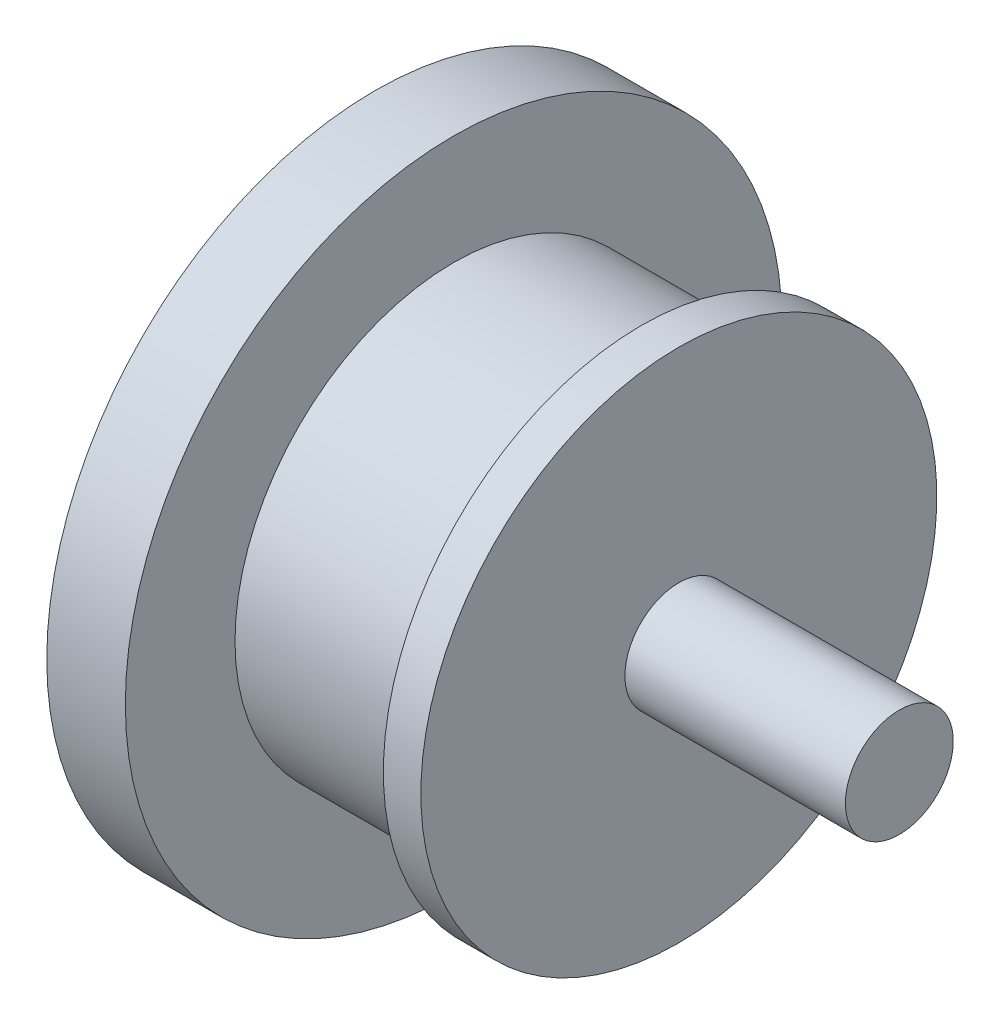
ISO-10303-21;
HEADER;
FILE_DESCRIPTION(('STEP AP214'),'2;1');
FILE_NAME('part.step','',(''),(''),'','','');
FILE_SCHEMA(('AUTOMOTIVE_DESIGN { 1 0 10303 214 1 1 1 1 }'));
ENDSEC;
DATA;
#1=APPLICATION_CONTEXT('core data for automotive mechanical design processes');
#2=APPLICATION_PROTOCOL_DEFINITION('international standard','automotive_design',2000,#1);
#3=PRODUCT_CONTEXT('',#1,'mechanical');
#4=PRODUCT('Part','Part','',(#3));
#5=PRODUCT_RELATED_PRODUCT_CATEGORY('part','',(#4));
#6=PRODUCT_DEFINITION_FORMATION('','',#4);
#7=PRODUCT_DEFINITION_CONTEXT('part definition',#1,'design');
#8=PRODUCT_DEFINITION('design','',#6,#7);
#9=PRODUCT_DEFINITION_SHAPE('','',#8);
#10=(LENGTH_UNIT() NAMED_UNIT(*) SI_UNIT(.MILLI.,.METRE.));
#11=(NAMED_UNIT(*) PLANE_ANGLE_UNIT() SI_UNIT($,.RADIAN.));
#12=(NAMED_UNIT(*) SI_UNIT($,.STERADIAN.) SOLID_ANGLE_UNIT());
#13=UNCERTAINTY_MEASURE_WITH_UNIT(LENGTH_MEASURE(1.E-05),#10,'distance_accuracy_value','');
#14=(GEOMETRIC_REPRESENTATION_CONTEXT(3) GLOBAL_UNCERTAINTY_ASSIGNED_CONTEXT((#13)) GLOBAL_UNIT_ASSIGNED_CONTEXT((#10,
#11,#12)) REPRESENTATION_CONTEXT('',''));
#15=CARTESIAN_POINT('',(0.,0.,0.));
#16=DIRECTION('',(0.,0.,1.));
#17=DIRECTION('',(1.,0.,0.));
#18=AXIS2_PLACEMENT_3D('',#15,#16,#17);
#19=CARTESIAN_POINT('',(15.,0.,0.));
#20=DIRECTION('',(1.,0.,0.));
#21=DIRECTION('',(0.,1.,0.));
#22=AXIS2_PLACEMENT_3D('',#19,#20,#21);
#23=PLANE('',#22);
#24=CARTESIAN_POINT('',(15.,0.,0.));
#25=DIRECTION('',(1.,0.,0.));
#26=DIRECTION('',(0.,1.,0.));
#27=AXIS2_PLACEMENT_3D('',#24,#25,#26);
#28=CIRCLE('',#27,2.3);
#29=CARTESIAN_POINT('',(15.,2.3,0.));
#30=VERTEX_POINT('',#29);
#31=EDGE_CURVE('E10',#30,#30,#28,.T.);
#32=ORIENTED_EDGE('',*,*,#31,.T.);
#33=EDGE_LOOP('',(#32));
#34=FACE_BOUND('',#33,.T.);
#35=ADVANCED_FACE('F31',(#34),#23,.T.);
#36=CARTESIAN_POINT('',(0.,0.,0.));
#37=DIRECTION('',(1.,0.,0.));
#38=DIRECTION('',(0.,1.,0.));
#39=AXIS2_PLACEMENT_3D('',#36,#37,#38);
#40=CYLINDRICAL_SURFACE('',#39,2.3);
#41=CARTESIAN_POINT('',(5.6,0.,0.));
#42=DIRECTION('',(1.,0.,0.));
#43=DIRECTION('',(0.,1.,0.));
#44=AXIS2_PLACEMENT_3D('',#41,#42,#43);
#45=CIRCLE('',#44,2.3);
#46=CARTESIAN_POINT('',(5.6,2.3,0.));
#47=VERTEX_POINT('',#46);
#48=EDGE_CURVE('E37',#47,#47,#45,.T.);
#49=ORIENTED_EDGE('',*,*,#48,.T.);
#50=EDGE_LOOP('',(#49));
#51=FACE_BOUND('',#50,.T.);
#52=ORIENTED_EDGE('',*,*,#31,.F.);
#53=EDGE_LOOP('',(#52));
#54=FACE_BOUND('',#53,.T.);
#55=ADVANCED_FACE('F75',(#51,#54),#40,.T.);
#56=CARTESIAN_POINT('',(5.6,11.,0.));
#57=DIRECTION('',(1.,0.,0.));
#58=DIRECTION('',(0.,1.,0.));
#59=AXIS2_PLACEMENT_3D('',#56,#57,#58);
#60=PLANE('',#59);
#61=CARTESIAN_POINT('',(5.6,0.,0.));
#62=DIRECTION('',(1.,0.,0.));
#63=DIRECTION('',(0.,1.,0.));
#64=AXIS2_PLACEMENT_3D('',#61,#62,#63);
#65=CIRCLE('',#64,11.);
#66=CARTESIAN_POINT('',(5.6,11.,0.));
#67=VERTEX_POINT('',#66);
#68=EDGE_CURVE('E41',#67,#67,#65,.T.);
#69=ORIENTED_EDGE('',*,*,#68,.T.);
#70=EDGE_LOOP('',(#69));
#71=FACE_BOUND('',#70,.T.);
#72=ORIENTED_EDGE('',*,*,#48,.F.);
#73=EDGE_LOOP('',(#72));
#74=FACE_BOUND('',#73,.T.);
#75=ADVANCED_FACE('F79',(#71,#74),#60,.T.);
#76=CARTESIAN_POINT('',(0.,0.,0.));
#77=DIRECTION('',(1.,0.,0.));
#78=DIRECTION('',(0.,1.,0.));
#79=AXIS2_PLACEMENT_3D('',#76,#77,#78);
#80=CYLINDRICAL_SURFACE('',#79,11.);
#81=CARTESIAN_POINT('',(4.,0.,0.));
#82=DIRECTION('',(1.,0.,0.));
#83=DIRECTION('',(0.,1.,0.));
#84=AXIS2_PLACEMENT_3D('',#81,#82,#83);
#85=CIRCLE('',#84,11.);
#86=CARTESIAN_POINT('',(4.,11.,0.));
#87=VERTEX_POINT('',#86);
#88=EDGE_CURVE('E45',#87,#87,#85,.T.);
#89=ORIENTED_EDGE('',*,*,#88,.T.);
#90=EDGE_LOOP('',(#89));
#91=FACE_BOUND('',#90,.T.);
#92=ORIENTED_EDGE('',*,*,#68,.F.);
#93=EDGE_LOOP('',(#92));
#94=FACE_BOUND('',#93,.T.);
#95=ADVANCED_FACE('F83',(#91,#94),#80,.T.);
#96=CARTESIAN_POINT('',(4.,9.325,0.));
#97=DIRECTION('',(-1.,0.,0.));
#98=DIRECTION('',(0.,-1.,0.));
#99=AXIS2_PLACEMENT_3D('',#96,#97,#98);
#100=PLANE('',#99);
#101=CARTESIAN_POINT('',(4.,0.,0.));
#102=DIRECTION('',(1.,0.,0.));
#103=DIRECTION('',(0.,1.,0.));
#104=AXIS2_PLACEMENT_3D('',#101,#102,#103);
#105=CIRCLE('',#104,9.325);
#106=CARTESIAN_POINT('',(4.,9.325,0.));
#107=VERTEX_POINT('',#106);
#108=EDGE_CURVE('E50',#107,#107,#105,.T.);
#109=ORIENTED_EDGE('',*,*,#108,.T.);
#110=EDGE_LOOP('',(#109));
#111=FACE_BOUND('',#110,.T.);
#112=ORIENTED_EDGE('',*,*,#88,.F.);
#113=EDGE_LOOP('',(#112));
#114=FACE_BOUND('',#113,.T.);
#115=ADVANCED_FACE('F90',(#111,#114),#100,.T.);
#116=CARTESIAN_POINT('',(0.,0.,0.));
#117=DIRECTION('',(1.,0.,0.));
#118=DIRECTION('',(0.,1.,0.));
#119=AXIS2_PLACEMENT_3D('',#116,#117,#118);
#120=CYLINDRICAL_SURFACE('',#119,9.325);
#121=CARTESIAN_POINT('',(-4.,0.,0.));
#122=DIRECTION('',(1.,0.,0.));
#123=DIRECTION('',(0.,1.,0.));
#124=AXIS2_PLACEMENT_3D('',#121,#122,#123);
#125=CIRCLE('',#124,9.325);
#126=CARTESIAN_POINT('',(-4.,9.325,0.));
#127=VERTEX_POINT('',#126);
#128=EDGE_CURVE('E53',#127,#127,#125,.T.);
#129=ORIENTED_EDGE('',*,*,#128,.T.);
#130=EDGE_LOOP('',(#129));
#131=FACE_BOUND('',#130,.T.);
#132=ORIENTED_EDGE('',*,*,#108,.F.);
#133=EDGE_LOOP('',(#132));
#134=FACE_BOUND('',#133,.T.);
#135=ADVANCED_FACE('F94',(#131,#134),#120,.T.);
#136=CARTESIAN_POINT('',(-4.,13.9999999999999,0.));
#137=DIRECTION('',(1.,0.,0.));
#138=DIRECTION('',(0.,1.,0.));
#139=AXIS2_PLACEMENT_3D('',#136,#137,#138);
#140=PLANE('',#139);
#141=CARTESIAN_POINT('',(-4.,0.,0.));
#142=DIRECTION('',(1.,0.,0.));
#143=DIRECTION('',(0.,1.,0.));
#144=AXIS2_PLACEMENT_3D('',#141,#142,#143);
#145=CIRCLE('',#144,13.9999999999999);
#146=CARTESIAN_POINT('',(-4.,13.9999999999999,0.));
#147=VERTEX_POINT('',#146);
#148=EDGE_CURVE('E56',#147,#147,#145,.T.);
#149=ORIENTED_EDGE('',*,*,#148,.T.);
#150=EDGE_LOOP('',(#149));
#151=FACE_BOUND('',#150,.T.);
#152=ORIENTED_EDGE('',*,*,#128,.F.);
#153=EDGE_LOOP('',(#152));
#154=FACE_BOUND('',#153,.T.);
#155=ADVANCED_FACE('F72',(#151,#154),#140,.T.);
#156=CARTESIAN_POINT('',(0.,0.,0.));
#157=DIRECTION('',(1.,0.,0.));
#158=DIRECTION('',(0.,1.,0.));
#159=AXIS2_PLACEMENT_3D('',#156,#157,#158);
#160=CYLINDRICAL_SURFACE('',#159,13.9999999999999);
#161=CARTESIAN_POINT('',(-7.35000000000001,0.,0.));
#162=DIRECTION('',(1.,0.,0.));
#163=DIRECTION('',(0.,1.,0.));
#164=AXIS2_PLACEMENT_3D('',#161,#162,#163);
#165=CIRCLE('',#164,13.9999999999999);
#166=CARTESIAN_POINT('',(-7.35000000000001,13.9999999999999,0.));
#167=VERTEX_POINT('',#166);
#168=EDGE_CURVE('E59',#167,#167,#165,.T.);
#169=ORIENTED_EDGE('',*,*,#168,.T.);
#170=EDGE_LOOP('',(#169));
#171=FACE_BOUND('',#170,.T.);
#172=ORIENTED_EDGE('',*,*,#148,.F.);
#173=EDGE_LOOP('',(#172));
#174=FACE_BOUND('',#173,.T.);
#175=ADVANCED_FACE('F63',(#171,#174),#160,.T.);
#176=CARTESIAN_POINT('',(-7.35000000000001,0.,0.));
#177=DIRECTION('',(-1.,0.,0.));
#178=DIRECTION('',(0.,-1.,0.));
#179=AXIS2_PLACEMENT_3D('',#176,#177,#178);
#180=PLANE('',#179);
#181=ORIENTED_EDGE('',*,*,#168,.F.);
#182=EDGE_LOOP('',(#181));
#183=FACE_BOUND('',#182,.T.);
#184=ADVANCED_FACE('F66',(#183),#180,.T.);
#185=CLOSED_SHELL('',(#35,#55,#75,#95,#115,#135,#155,#175,#184));
#186=MANIFOLD_SOLID_BREP('B2',#185);
#187=ADVANCED_BREP_SHAPE_REPRESENTATION('',(#18,#186),#14);
#188=SHAPE_DEFINITION_REPRESENTATION(#9,#187);
ENDSEC;
END-ISO-10303-21;
